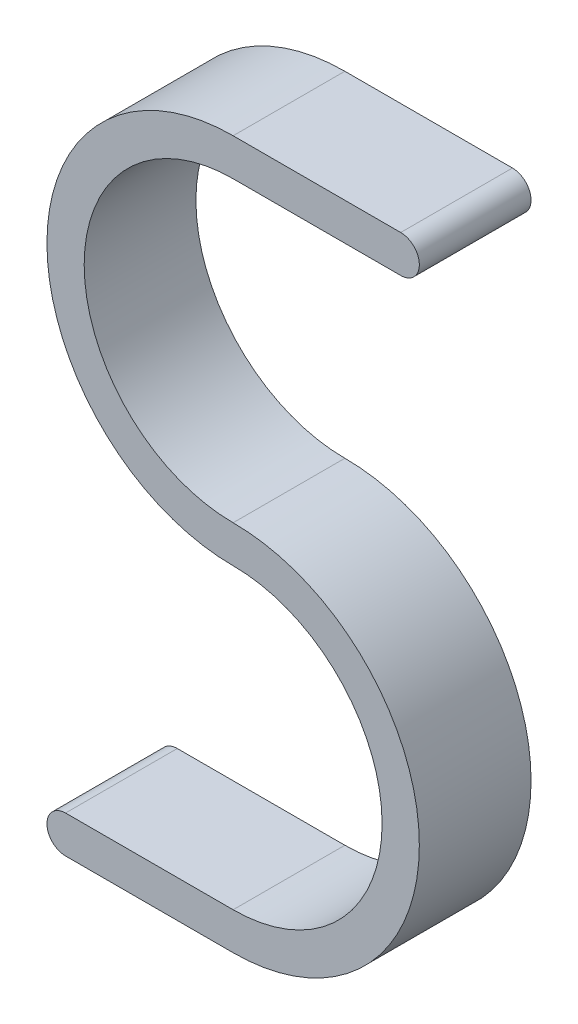
ISO-10303-21;
HEADER;
FILE_DESCRIPTION(('STEP AP214'),'2;1');
FILE_NAME('part.step','',(''),(''),'','','');
FILE_SCHEMA(('AUTOMOTIVE_DESIGN { 1 0 10303 214 1 1 1 1 }'));
ENDSEC;
DATA;
#1=APPLICATION_CONTEXT('core data for automotive mechanical design processes');
#2=APPLICATION_PROTOCOL_DEFINITION('international standard','automotive_design',2000,#1);
#3=PRODUCT_CONTEXT('',#1,'mechanical');
#4=PRODUCT('Part','Part','',(#3));
#5=PRODUCT_RELATED_PRODUCT_CATEGORY('part','',(#4));
#6=PRODUCT_DEFINITION_FORMATION('','',#4);
#7=PRODUCT_DEFINITION_CONTEXT('part definition',#1,'design');
#8=PRODUCT_DEFINITION('design','',#6,#7);
#9=PRODUCT_DEFINITION_SHAPE('','',#8);
#10=(LENGTH_UNIT() NAMED_UNIT(*) SI_UNIT(.MILLI.,.METRE.));
#11=(NAMED_UNIT(*) PLANE_ANGLE_UNIT() SI_UNIT($,.RADIAN.));
#12=(NAMED_UNIT(*) SI_UNIT($,.STERADIAN.) SOLID_ANGLE_UNIT());
#13=UNCERTAINTY_MEASURE_WITH_UNIT(LENGTH_MEASURE(1.E-05),#10,'distance_accuracy_value','');
#14=(GEOMETRIC_REPRESENTATION_CONTEXT(3) GLOBAL_UNCERTAINTY_ASSIGNED_CONTEXT((#13)) GLOBAL_UNIT_ASSIGNED_CONTEXT((#10,
#11,#12)) REPRESENTATION_CONTEXT('',''));
#15=CARTESIAN_POINT('',(0.,0.,0.));
#16=DIRECTION('',(0.,0.,1.));
#17=DIRECTION('',(1.,0.,0.));
#18=AXIS2_PLACEMENT_3D('',#15,#16,#17);
#19=CARTESIAN_POINT('',(-0.828856515858789,20.,15.));
#20=DIRECTION('',(0.,0.,-1.));
#21=DIRECTION('',(-1.,0.,0.));
#22=AXIS2_PLACEMENT_3D('',#19,#20,#21);
#23=CYLINDRICAL_SURFACE('',#22,25.);
#24=CARTESIAN_POINT('',(-0.828856515858789,20.,0.));
#25=DIRECTION('',(0.,0.,1.));
#26=DIRECTION('',(1.,0.,0.));
#27=AXIS2_PLACEMENT_3D('',#24,#25,#26);
#28=CIRCLE('',#27,25.);
#29=CARTESIAN_POINT('',(-0.828856515858789,45.,0.));
#30=VERTEX_POINT('',#29);
#31=CARTESIAN_POINT('',(-0.828856515858793,-5.,0.));
#32=VERTEX_POINT('',#31);
#33=EDGE_CURVE('E152',#30,#32,#28,.T.);
#34=ORIENTED_EDGE('',*,*,#33,.T.);
#35=DIRECTION('',(0.,0.,-1.));
#36=VECTOR('',#35,1.);
#37=CARTESIAN_POINT('',(-0.828856515858793,-5.,15.));
#38=LINE('',#37,#36);
#39=CARTESIAN_POINT('',(-0.828856515858793,-5.,15.));
#40=VERTEX_POINT('',#39);
#41=EDGE_CURVE('E11',#40,#32,#38,.T.);
#42=ORIENTED_EDGE('',*,*,#41,.F.);
#43=CARTESIAN_POINT('',(-0.828856515858789,20.,15.));
#44=DIRECTION('',(0.,0.,1.));
#45=DIRECTION('',(1.,0.,0.));
#46=AXIS2_PLACEMENT_3D('',#43,#44,#45);
#47=CIRCLE('',#46,25.);
#48=CARTESIAN_POINT('',(-0.828856515858789,45.,15.));
#49=VERTEX_POINT('',#48);
#50=EDGE_CURVE('E180',#49,#40,#47,.T.);
#51=ORIENTED_EDGE('',*,*,#50,.F.);
#52=DIRECTION('',(0.,0.,-1.));
#53=VECTOR('',#52,1.);
#54=CARTESIAN_POINT('',(-0.828856515858789,45.,15.));
#55=LINE('',#54,#53);
#56=EDGE_CURVE('E148',#49,#30,#55,.T.);
#57=ORIENTED_EDGE('',*,*,#56,.T.);
#58=EDGE_LOOP('',(#34,#42,#51,#57));
#59=FACE_BOUND('',#58,.T.);
#60=ADVANCED_FACE('F39',(#59),#23,.T.);
#61=CARTESIAN_POINT('',(-0.828856515858777,-25.,15.));
#62=DIRECTION('',(0.,0.,-1.));
#63=DIRECTION('',(-1.,0.,0.));
#64=AXIS2_PLACEMENT_3D('',#61,#62,#63);
#65=CYLINDRICAL_SURFACE('',#64,20.);
#66=CARTESIAN_POINT('',(-0.828856515858777,-25.,0.));
#67=DIRECTION('',(0.,0.,-1.));
#68=DIRECTION('',(1.,0.,0.));
#69=AXIS2_PLACEMENT_3D('',#66,#67,#68);
#70=CIRCLE('',#69,20.);
#71=CARTESIAN_POINT('',(-0.828856515858782,-45.,0.));
#72=VERTEX_POINT('',#71);
#73=EDGE_CURVE('E156',#32,#72,#70,.T.);
#74=ORIENTED_EDGE('',*,*,#73,.T.);
#75=DIRECTION('',(0.,0.,-1.));
#76=VECTOR('',#75,1.);
#77=CARTESIAN_POINT('',(-0.828856515858782,-45.,15.));
#78=LINE('',#77,#76);
#79=CARTESIAN_POINT('',(-0.828856515858782,-45.,15.));
#80=VERTEX_POINT('',#79);
#81=EDGE_CURVE('E48',#80,#72,#78,.T.);
#82=ORIENTED_EDGE('',*,*,#81,.F.);
#83=CARTESIAN_POINT('',(-0.828856515858777,-25.,15.));
#84=DIRECTION('',(0.,0.,-1.));
#85=DIRECTION('',(1.,0.,0.));
#86=AXIS2_PLACEMENT_3D('',#83,#84,#85);
#87=CIRCLE('',#86,20.);
#88=EDGE_CURVE('E105',#40,#80,#87,.T.);
#89=ORIENTED_EDGE('',*,*,#88,.F.);
#90=ORIENTED_EDGE('',*,*,#41,.T.);
#91=EDGE_LOOP('',(#74,#82,#89,#90));
#92=FACE_BOUND('',#91,.T.);
#93=ADVANCED_FACE('F244',(#92),#65,.F.);
#94=CARTESIAN_POINT('',(-0.828856515858782,-45.,15.));
#95=DIRECTION('',(0.,-1.,0.));
#96=DIRECTION('',(0.,0.,-1.));
#97=AXIS2_PLACEMENT_3D('',#94,#95,#96);
#98=PLANE('',#97);
#99=DIRECTION('',(-1.,0.,0.));
#100=VECTOR('',#99,1.);
#101=CARTESIAN_POINT('',(-0.828856515858782,-45.,0.));
#102=LINE('',#101,#100);
#103=CARTESIAN_POINT('',(-23.328897213332,-45.0000000001656,0.));
#104=VERTEX_POINT('',#103);
#105=EDGE_CURVE('E159',#72,#104,#102,.T.);
#106=ORIENTED_EDGE('',*,*,#105,.T.);
#107=DIRECTION('',(0.,0.,-1.));
#108=VECTOR('',#107,1.);
#109=CARTESIAN_POINT('',(-23.328897213332,-45.0000000001656,15.));
#110=LINE('',#109,#108);
#111=CARTESIAN_POINT('',(-23.328897213332,-45.0000000001656,15.));
#112=VERTEX_POINT('',#111);
#113=EDGE_CURVE('E199',#112,#104,#110,.T.);
#114=ORIENTED_EDGE('',*,*,#113,.F.);
#115=DIRECTION('',(-1.,0.,0.));
#116=VECTOR('',#115,1.);
#117=CARTESIAN_POINT('',(-0.828856515858782,-45.,15.));
#118=LINE('',#117,#116);
#119=EDGE_CURVE('E209',#80,#112,#118,.T.);
#120=ORIENTED_EDGE('',*,*,#119,.F.);
#121=ORIENTED_EDGE('',*,*,#81,.T.);
#122=EDGE_LOOP('',(#106,#114,#120,#121));
#123=FACE_BOUND('',#122,.T.);
#124=ADVANCED_FACE('F207',(#123),#98,.F.);
#125=CARTESIAN_POINT('',(-23.328897213332,-47.5000000003312,15.));
#126=DIRECTION('',(0.,0.,-1.));
#127=DIRECTION('',(-1.,0.,0.));
#128=AXIS2_PLACEMENT_3D('',#125,#126,#127);
#129=CYLINDRICAL_SURFACE('',#128,2.50000000016563);
#130=CARTESIAN_POINT('',(-23.328897213332,-47.5000000003312,0.));
#131=DIRECTION('',(0.,0.,1.));
#132=DIRECTION('',(1.,0.,0.));
#133=AXIS2_PLACEMENT_3D('',#130,#131,#132);
#134=CIRCLE('',#133,2.50000000016563);
#135=CARTESIAN_POINT('',(-23.3288565158588,-50.,0.));
#136=VERTEX_POINT('',#135);
#137=EDGE_CURVE('E162',#104,#136,#134,.T.);
#138=ORIENTED_EDGE('',*,*,#137,.T.);
#139=DIRECTION('',(0.,0.,-1.));
#140=VECTOR('',#139,1.);
#141=CARTESIAN_POINT('',(-23.3288565158588,-50.,15.));
#142=LINE('',#141,#140);
#143=CARTESIAN_POINT('',(-23.3288565158588,-50.,15.));
#144=VERTEX_POINT('',#143);
#145=EDGE_CURVE('E195',#144,#136,#142,.T.);
#146=ORIENTED_EDGE('',*,*,#145,.F.);
#147=CARTESIAN_POINT('',(-23.328897213332,-47.5000000003312,15.));
#148=DIRECTION('',(0.,0.,1.));
#149=DIRECTION('',(1.,0.,0.));
#150=AXIS2_PLACEMENT_3D('',#147,#148,#149);
#151=CIRCLE('',#150,2.50000000016563);
#152=EDGE_CURVE('E228',#112,#144,#151,.T.);
#153=ORIENTED_EDGE('',*,*,#152,.F.);
#154=ORIENTED_EDGE('',*,*,#113,.T.);
#155=EDGE_LOOP('',(#138,#146,#153,#154));
#156=FACE_BOUND('',#155,.T.);
#157=ADVANCED_FACE('F218',(#156),#129,.T.);
#158=CARTESIAN_POINT('',(-23.3288565158588,-50.,15.));
#159=DIRECTION('',(0.,1.,0.));
#160=DIRECTION('',(-1.,0.,0.));
#161=AXIS2_PLACEMENT_3D('',#158,#159,#160);
#162=PLANE('',#161);
#163=DIRECTION('',(1.,0.,0.));
#164=VECTOR('',#163,1.);
#165=CARTESIAN_POINT('',(-23.3288565158588,-50.,0.));
#166=LINE('',#165,#164);
#167=CARTESIAN_POINT('',(-0.828856515858781,-50.,0.));
#168=VERTEX_POINT('',#167);
#169=EDGE_CURVE('E165',#136,#168,#166,.T.);
#170=ORIENTED_EDGE('',*,*,#169,.T.);
#171=DIRECTION('',(0.,0.,-1.));
#172=VECTOR('',#171,1.);
#173=CARTESIAN_POINT('',(-0.828856515858781,-50.,15.));
#174=LINE('',#173,#172);
#175=CARTESIAN_POINT('',(-0.828856515858781,-50.,15.));
#176=VERTEX_POINT('',#175);
#177=EDGE_CURVE('E191',#176,#168,#174,.T.);
#178=ORIENTED_EDGE('',*,*,#177,.F.);
#179=DIRECTION('',(1.,0.,0.));
#180=VECTOR('',#179,1.);
#181=CARTESIAN_POINT('',(-23.3288565158588,-50.,15.));
#182=LINE('',#181,#180);
#183=EDGE_CURVE('E224',#144,#176,#182,.T.);
#184=ORIENTED_EDGE('',*,*,#183,.F.);
#185=ORIENTED_EDGE('',*,*,#145,.T.);
#186=EDGE_LOOP('',(#170,#178,#184,#185));
#187=FACE_BOUND('',#186,.T.);
#188=ADVANCED_FACE('F222',(#187),#162,.F.);
#189=CARTESIAN_POINT('',(-0.828856515858777,-25.,15.));
#190=DIRECTION('',(0.,0.,-1.));
#191=DIRECTION('',(-1.,0.,0.));
#192=AXIS2_PLACEMENT_3D('',#189,#190,#191);
#193=CYLINDRICAL_SURFACE('',#192,25.);
#194=CARTESIAN_POINT('',(-0.828856515858777,-25.,0.));
#195=DIRECTION('',(0.,0.,1.));
#196=DIRECTION('',(1.,0.,0.));
#197=AXIS2_PLACEMENT_3D('',#194,#195,#196);
#198=CIRCLE('',#197,25.);
#199=CARTESIAN_POINT('',(-0.828856515858793,0.,0.));
#200=VERTEX_POINT('',#199);
#201=EDGE_CURVE('E168',#168,#200,#198,.T.);
#202=ORIENTED_EDGE('',*,*,#201,.T.);
#203=DIRECTION('',(0.,0.,-1.));
#204=VECTOR('',#203,1.);
#205=CARTESIAN_POINT('',(-0.828856515858793,0.,15.));
#206=LINE('',#205,#204);
#207=CARTESIAN_POINT('',(-0.828856515858793,0.,15.));
#208=VERTEX_POINT('',#207);
#209=EDGE_CURVE('E187',#208,#200,#206,.T.);
#210=ORIENTED_EDGE('',*,*,#209,.F.);
#211=CARTESIAN_POINT('',(-0.828856515858777,-25.,15.));
#212=DIRECTION('',(0.,0.,1.));
#213=DIRECTION('',(1.,0.,0.));
#214=AXIS2_PLACEMENT_3D('',#211,#212,#213);
#215=CIRCLE('',#214,25.);
#216=EDGE_CURVE('E227',#176,#208,#215,.T.);
#217=ORIENTED_EDGE('',*,*,#216,.F.);
#218=ORIENTED_EDGE('',*,*,#177,.T.);
#219=EDGE_LOOP('',(#202,#210,#217,#218));
#220=FACE_BOUND('',#219,.T.);
#221=ADVANCED_FACE('F256',(#220),#193,.T.);
#222=CARTESIAN_POINT('',(-0.828856515858789,20.,15.));
#223=DIRECTION('',(0.,0.,-1.));
#224=DIRECTION('',(-1.,0.,0.));
#225=AXIS2_PLACEMENT_3D('',#222,#223,#224);
#226=CYLINDRICAL_SURFACE('',#225,20.);
#227=CARTESIAN_POINT('',(-0.828856515858789,20.,0.));
#228=DIRECTION('',(0.,0.,-1.));
#229=DIRECTION('',(1.,0.,0.));
#230=AXIS2_PLACEMENT_3D('',#227,#228,#229);
#231=CIRCLE('',#230,20.);
#232=CARTESIAN_POINT('',(-0.828856515858789,40.,0.));
#233=VERTEX_POINT('',#232);
#234=EDGE_CURVE('E171',#200,#233,#231,.T.);
#235=ORIENTED_EDGE('',*,*,#234,.T.);
#236=DIRECTION('',(0.,0.,-1.));
#237=VECTOR('',#236,1.);
#238=CARTESIAN_POINT('',(-0.828856515858789,40.,15.));
#239=LINE('',#238,#237);
#240=CARTESIAN_POINT('',(-0.828856515858789,40.,15.));
#241=VERTEX_POINT('',#240);
#242=EDGE_CURVE('E141',#241,#233,#239,.T.);
#243=ORIENTED_EDGE('',*,*,#242,.F.);
#244=CARTESIAN_POINT('',(-0.828856515858789,20.,15.));
#245=DIRECTION('',(0.,0.,-1.));
#246=DIRECTION('',(1.,0.,0.));
#247=AXIS2_PLACEMENT_3D('',#244,#245,#246);
#248=CIRCLE('',#247,20.);
#249=EDGE_CURVE('E130',#208,#241,#248,.T.);
#250=ORIENTED_EDGE('',*,*,#249,.F.);
#251=ORIENTED_EDGE('',*,*,#209,.T.);
#252=EDGE_LOOP('',(#235,#243,#250,#251));
#253=FACE_BOUND('',#252,.T.);
#254=ADVANCED_FACE('F259',(#253),#226,.F.);
#255=CARTESIAN_POINT('',(-0.828856515858789,40.,15.));
#256=DIRECTION('',(0.,1.,0.));
#257=DIRECTION('',(0.,0.,1.));
#258=AXIS2_PLACEMENT_3D('',#255,#256,#257);
#259=PLANE('',#258);
#260=DIRECTION('',(1.,0.,0.));
#261=VECTOR('',#260,1.);
#262=CARTESIAN_POINT('',(-0.828856515858789,40.,0.));
#263=LINE('',#262,#261);
#264=CARTESIAN_POINT('',(21.6711841816144,40.0000000001656,0.));
#265=VERTEX_POINT('',#264);
#266=EDGE_CURVE('E139',#233,#265,#263,.T.);
#267=ORIENTED_EDGE('',*,*,#266,.T.);
#268=DIRECTION('',(0.,0.,-1.));
#269=VECTOR('',#268,1.);
#270=CARTESIAN_POINT('',(21.6711841816144,40.0000000001656,15.));
#271=LINE('',#270,#269);
#272=CARTESIAN_POINT('',(21.6711841816144,40.0000000001656,15.));
#273=VERTEX_POINT('',#272);
#274=EDGE_CURVE('E136',#273,#265,#271,.T.);
#275=ORIENTED_EDGE('',*,*,#274,.F.);
#276=DIRECTION('',(1.,0.,0.));
#277=VECTOR('',#276,1.);
#278=CARTESIAN_POINT('',(-0.828856515858789,40.,15.));
#279=LINE('',#278,#277);
#280=EDGE_CURVE('E124',#241,#273,#279,.T.);
#281=ORIENTED_EDGE('',*,*,#280,.F.);
#282=ORIENTED_EDGE('',*,*,#242,.T.);
#283=EDGE_LOOP('',(#267,#275,#281,#282));
#284=FACE_BOUND('',#283,.T.);
#285=ADVANCED_FACE('F137',(#284),#259,.F.);
#286=CARTESIAN_POINT('',(21.6711841816144,42.5000000003313,15.));
#287=DIRECTION('',(0.,0.,-1.));
#288=DIRECTION('',(-1.,0.,0.));
#289=AXIS2_PLACEMENT_3D('',#286,#287,#288);
#290=CYLINDRICAL_SURFACE('',#289,2.50000000016563);
#291=CARTESIAN_POINT('',(21.6711841816144,42.5000000003313,0.));
#292=DIRECTION('',(0.,0.,1.));
#293=DIRECTION('',(1.,0.,0.));
#294=AXIS2_PLACEMENT_3D('',#291,#292,#293);
#295=CIRCLE('',#294,2.50000000016563);
#296=CARTESIAN_POINT('',(21.6711434841412,45.,0.));
#297=VERTEX_POINT('',#296);
#298=EDGE_CURVE('E91',#265,#297,#295,.T.);
#299=ORIENTED_EDGE('',*,*,#298,.T.);
#300=DIRECTION('',(0.,0.,-1.));
#301=VECTOR('',#300,1.);
#302=CARTESIAN_POINT('',(21.6711434841412,45.,15.));
#303=LINE('',#302,#301);
#304=CARTESIAN_POINT('',(21.6711434841412,45.,15.));
#305=VERTEX_POINT('',#304);
#306=EDGE_CURVE('E142',#305,#297,#303,.T.);
#307=ORIENTED_EDGE('',*,*,#306,.F.);
#308=CARTESIAN_POINT('',(21.6711841816144,42.5000000003313,15.));
#309=DIRECTION('',(0.,0.,1.));
#310=DIRECTION('',(1.,0.,0.));
#311=AXIS2_PLACEMENT_3D('',#308,#309,#310);
#312=CIRCLE('',#311,2.50000000016563);
#313=EDGE_CURVE('E128',#273,#305,#312,.T.);
#314=ORIENTED_EDGE('',*,*,#313,.F.);
#315=ORIENTED_EDGE('',*,*,#274,.T.);
#316=EDGE_LOOP('',(#299,#307,#314,#315));
#317=FACE_BOUND('',#316,.T.);
#318=ADVANCED_FACE('F144',(#317),#290,.T.);
#319=CARTESIAN_POINT('',(21.6711434841412,45.,15.));
#320=DIRECTION('',(0.,-1.,0.));
#321=DIRECTION('',(1.,0.,0.));
#322=AXIS2_PLACEMENT_3D('',#319,#320,#321);
#323=PLANE('',#322);
#324=DIRECTION('',(-1.,0.,0.));
#325=VECTOR('',#324,1.);
#326=CARTESIAN_POINT('',(21.6711434841412,45.,0.));
#327=LINE('',#326,#325);
#328=EDGE_CURVE('E97',#297,#30,#327,.T.);
#329=ORIENTED_EDGE('',*,*,#328,.T.);
#330=ORIENTED_EDGE('',*,*,#56,.F.);
#331=DIRECTION('',(-1.,0.,0.));
#332=VECTOR('',#331,1.);
#333=CARTESIAN_POINT('',(21.6711434841412,45.,15.));
#334=LINE('',#333,#332);
#335=EDGE_CURVE('E56',#305,#49,#334,.T.);
#336=ORIENTED_EDGE('',*,*,#335,.F.);
#337=ORIENTED_EDGE('',*,*,#306,.T.);
#338=EDGE_LOOP('',(#329,#330,#336,#337));
#339=FACE_BOUND('',#338,.T.);
#340=ADVANCED_FACE('F268',(#339),#323,.F.);
#341=CARTESIAN_POINT('',(-0.828856515858789,20.,15.));
#342=DIRECTION('',(0.,0.,1.));
#343=DIRECTION('',(1.,0.,0.));
#344=AXIS2_PLACEMENT_3D('',#341,#342,#343);
#345=PLANE('',#344);
#346=ORIENTED_EDGE('',*,*,#50,.T.);
#347=ORIENTED_EDGE('',*,*,#88,.T.);
#348=ORIENTED_EDGE('',*,*,#119,.T.);
#349=ORIENTED_EDGE('',*,*,#152,.T.);
#350=ORIENTED_EDGE('',*,*,#183,.T.);
#351=ORIENTED_EDGE('',*,*,#216,.T.);
#352=ORIENTED_EDGE('',*,*,#249,.T.);
#353=ORIENTED_EDGE('',*,*,#280,.T.);
#354=ORIENTED_EDGE('',*,*,#313,.T.);
#355=ORIENTED_EDGE('',*,*,#335,.T.);
#356=EDGE_LOOP('',(#346,#347,#348,#349,#350,#351,#352,#353,#354,#355));
#357=FACE_BOUND('',#356,.T.);
#358=ADVANCED_FACE('F126',(#357),#345,.T.);
#359=CARTESIAN_POINT('',(-0.828856515858789,20.,0.));
#360=DIRECTION('',(0.,0.,1.));
#361=DIRECTION('',(1.,0.,0.));
#362=AXIS2_PLACEMENT_3D('',#359,#360,#361);
#363=PLANE('',#362);
#364=ORIENTED_EDGE('',*,*,#33,.F.);
#365=ORIENTED_EDGE('',*,*,#328,.F.);
#366=ORIENTED_EDGE('',*,*,#298,.F.);
#367=ORIENTED_EDGE('',*,*,#266,.F.);
#368=ORIENTED_EDGE('',*,*,#234,.F.);
#369=ORIENTED_EDGE('',*,*,#201,.F.);
#370=ORIENTED_EDGE('',*,*,#169,.F.);
#371=ORIENTED_EDGE('',*,*,#137,.F.);
#372=ORIENTED_EDGE('',*,*,#105,.F.);
#373=ORIENTED_EDGE('',*,*,#73,.F.);
#374=EDGE_LOOP('',(#364,#365,#366,#367,#368,#369,#370,#371,#372,#373));
#375=FACE_BOUND('',#374,.T.);
#376=ADVANCED_FACE('F213',(#375),#363,.F.);
#377=CLOSED_SHELL('',(#60,#93,#124,#157,#188,#221,#254,#285,#318,#340,#358,#376));
#378=MANIFOLD_SOLID_BREP('B2',#377);
#379=ADVANCED_BREP_SHAPE_REPRESENTATION('',(#18,#378),#14);
#380=SHAPE_DEFINITION_REPRESENTATION(#9,#379);
ENDSEC;
END-ISO-10303-21;
